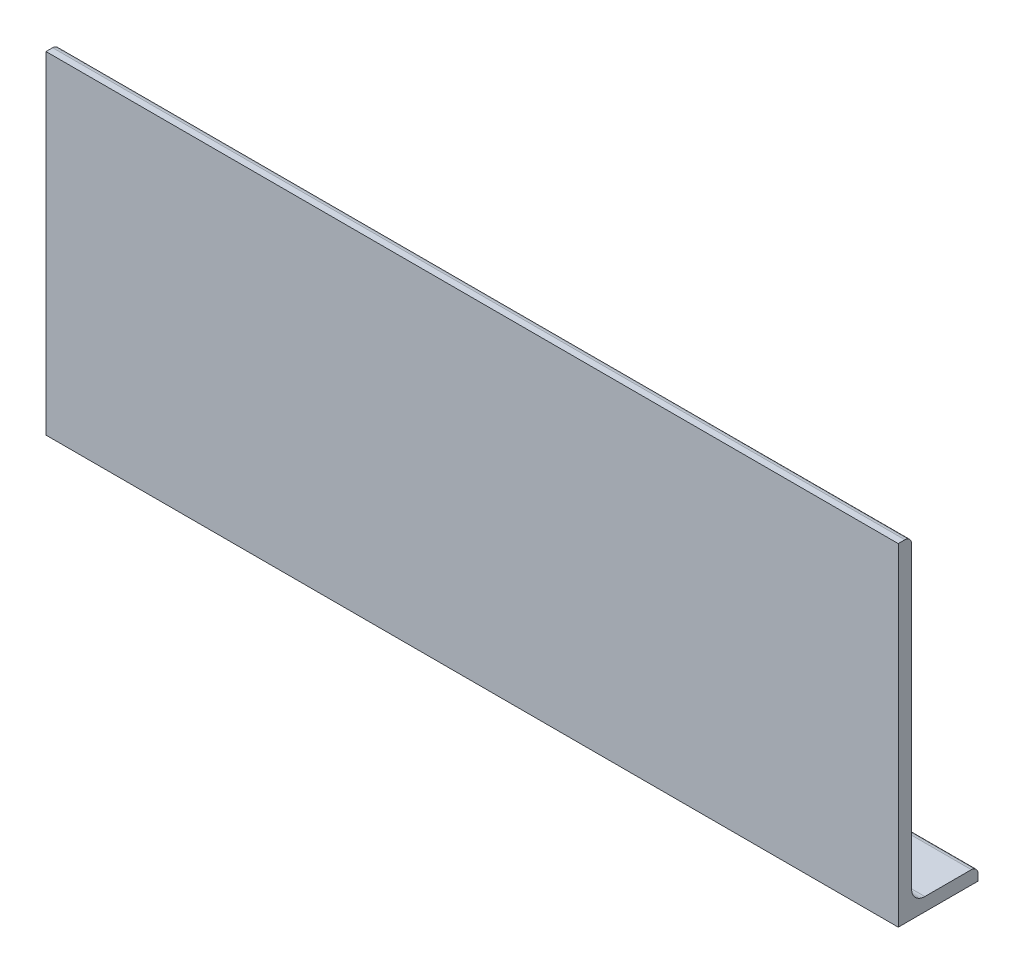
ISO-10303-21;
HEADER;
FILE_DESCRIPTION(('STEP AP214'),'2;1');
FILE_NAME('part.step','',(''),(''),'','','');
FILE_SCHEMA(('AUTOMOTIVE_DESIGN { 1 0 10303 214 1 1 1 1 }'));
ENDSEC;
DATA;
#1=APPLICATION_CONTEXT('core data for automotive mechanical design processes');
#2=APPLICATION_PROTOCOL_DEFINITION('international standard','automotive_design',2000,#1);
#3=PRODUCT_CONTEXT('',#1,'mechanical');
#4=PRODUCT('Part','Part','',(#3));
#5=PRODUCT_RELATED_PRODUCT_CATEGORY('part','',(#4));
#6=PRODUCT_DEFINITION_FORMATION('','',#4);
#7=PRODUCT_DEFINITION_CONTEXT('part definition',#1,'design');
#8=PRODUCT_DEFINITION('design','',#6,#7);
#9=PRODUCT_DEFINITION_SHAPE('','',#8);
#10=(LENGTH_UNIT() NAMED_UNIT(*) SI_UNIT(.MILLI.,.METRE.));
#11=(NAMED_UNIT(*) PLANE_ANGLE_UNIT() SI_UNIT($,.RADIAN.));
#12=(NAMED_UNIT(*) SI_UNIT($,.STERADIAN.) SOLID_ANGLE_UNIT());
#13=UNCERTAINTY_MEASURE_WITH_UNIT(LENGTH_MEASURE(1.E-05),#10,'distance_accuracy_value','');
#14=(GEOMETRIC_REPRESENTATION_CONTEXT(3) GLOBAL_UNCERTAINTY_ASSIGNED_CONTEXT((#13)) GLOBAL_UNIT_ASSIGNED_CONTEXT((#10,
#11,#12)) REPRESENTATION_CONTEXT('',''));
#15=CARTESIAN_POINT('',(0.,0.,0.));
#16=DIRECTION('',(0.,0.,1.));
#17=DIRECTION('',(1.,0.,0.));
#18=AXIS2_PLACEMENT_3D('',#15,#16,#17);
#19=CARTESIAN_POINT('',(128.27,-39.2153009702238,125.69753119505));
#20=DIRECTION('',(0.,-1.,0.));
#21=DIRECTION('',(0.,0.,-1.));
#22=AXIS2_PLACEMENT_3D('',#19,#20,#21);
#23=PLANE('',#22);
#24=DIRECTION('',(0.,0.,1.));
#25=VECTOR('',#24,1.);
#26=CARTESIAN_POINT('',(128.27,-39.2153009702238,125.69753119505));
#27=LINE('',#26,#25);
#28=CARTESIAN_POINT('',(128.27,-39.2153009702238,126.69753119505));
#29=VERTEX_POINT('',#28);
#30=CARTESIAN_POINT('',(128.27,-39.2153009702238,127.69753119505));
#31=VERTEX_POINT('',#30);
#32=EDGE_CURVE('E103',#29,#31,#27,.T.);
#33=ORIENTED_EDGE('',*,*,#32,.F.);
#34=DIRECTION('',(-1.,0.,0.));
#35=VECTOR('',#34,1.);
#36=CARTESIAN_POINT('',(128.27,-39.2153009702238,126.69753119505));
#37=LINE('',#36,#35);
#38=CARTESIAN_POINT('',(0.,-39.2153009702238,126.69753119505));
#39=VERTEX_POINT('',#38);
#40=EDGE_CURVE('E147',#29,#39,#37,.T.);
#41=ORIENTED_EDGE('',*,*,#40,.T.);
#42=DIRECTION('',(0.,0.,1.));
#43=VECTOR('',#42,1.);
#44=CARTESIAN_POINT('',(0.,-39.2153009702238,125.69753119505));
#45=LINE('',#44,#43);
#46=CARTESIAN_POINT('',(0.,-39.2153009702238,127.69753119505));
#47=VERTEX_POINT('',#46);
#48=EDGE_CURVE('E127',#39,#47,#45,.T.);
#49=ORIENTED_EDGE('',*,*,#48,.T.);
#50=DIRECTION('',(-1.,0.,0.));
#51=VECTOR('',#50,1.);
#52=CARTESIAN_POINT('',(128.27,-39.2153009702238,127.69753119505));
#53=LINE('',#52,#51);
#54=EDGE_CURVE('E120',#31,#47,#53,.T.);
#55=ORIENTED_EDGE('',*,*,#54,.F.);
#56=EDGE_LOOP('',(#33,#41,#49,#55));
#57=FACE_BOUND('',#56,.T.);
#58=ADVANCED_FACE('F33',(#57),#23,.F.);
#59=CARTESIAN_POINT('',(128.27,-39.2153009702238,127.69753119505));
#60=DIRECTION('',(0.,0.,-1.));
#61=DIRECTION('',(-1.,0.,0.));
#62=AXIS2_PLACEMENT_3D('',#59,#60,#61);
#63=PLANE('',#62);
#64=DIRECTION('',(0.,-1.,0.));
#65=VECTOR('',#64,1.);
#66=CARTESIAN_POINT('',(0.,-39.2153009702238,127.69753119505));
#67=LINE('',#66,#65);
#68=CARTESIAN_POINT('',(0.,-89.2153009702238,127.69753119505));
#69=VERTEX_POINT('',#68);
#70=EDGE_CURVE('E182',#47,#69,#67,.T.);
#71=ORIENTED_EDGE('',*,*,#70,.T.);
#72=DIRECTION('',(-1.,0.,0.));
#73=VECTOR('',#72,1.);
#74=CARTESIAN_POINT('',(128.27,-89.2153009702238,127.69753119505));
#75=LINE('',#74,#73);
#76=CARTESIAN_POINT('',(128.27,-89.2153009702238,127.69753119505));
#77=VERTEX_POINT('',#76);
#78=EDGE_CURVE('E122',#77,#69,#75,.T.);
#79=ORIENTED_EDGE('',*,*,#78,.F.);
#80=DIRECTION('',(0.,-1.,0.));
#81=VECTOR('',#80,1.);
#82=CARTESIAN_POINT('',(128.27,-39.2153009702238,127.69753119505));
#83=LINE('',#82,#81);
#84=EDGE_CURVE('E107',#31,#77,#83,.T.);
#85=ORIENTED_EDGE('',*,*,#84,.F.);
#86=ORIENTED_EDGE('',*,*,#54,.T.);
#87=EDGE_LOOP('',(#71,#79,#85,#86));
#88=FACE_BOUND('',#87,.T.);
#89=ADVANCED_FACE('F119',(#88),#63,.F.);
#90=CARTESIAN_POINT('',(128.27,-89.2153009702238,127.69753119505));
#91=DIRECTION('',(0.,1.,0.));
#92=DIRECTION('',(0.,0.,1.));
#93=AXIS2_PLACEMENT_3D('',#90,#91,#92);
#94=PLANE('',#93);
#95=CARTESIAN_POINT('',(20.,-89.2153009702238,120.19753119505));
#96=DIRECTION('',(0.,1.,0.));
#97=DIRECTION('',(0.,0.,1.));
#98=AXIS2_PLACEMENT_3D('',#95,#96,#97);
#99=CIRCLE('',#98,1.60000000000001);
#100=CARTESIAN_POINT('',(20.,-89.2153009702238,121.79753119505));
#101=VERTEX_POINT('',#100);
#102=EDGE_CURVE('E183',#101,#101,#99,.T.);
#103=ORIENTED_EDGE('',*,*,#102,.T.);
#104=EDGE_LOOP('',(#103));
#105=FACE_BOUND('',#104,.T.);
#106=CARTESIAN_POINT('',(108.27,-89.2153009702238,120.19753119505));
#107=DIRECTION('',(0.,1.,0.));
#108=DIRECTION('',(0.,0.,1.));
#109=AXIS2_PLACEMENT_3D('',#106,#107,#108);
#110=CIRCLE('',#109,1.60000000000001);
#111=CARTESIAN_POINT('',(108.27,-89.2153009702238,121.79753119505));
#112=VERTEX_POINT('',#111);
#113=EDGE_CURVE('E240',#112,#112,#110,.T.);
#114=ORIENTED_EDGE('',*,*,#113,.T.);
#115=EDGE_LOOP('',(#114));
#116=FACE_BOUND('',#115,.T.);
#117=DIRECTION('',(0.,0.,-1.));
#118=VECTOR('',#117,1.);
#119=CARTESIAN_POINT('',(0.,-89.2153009702238,127.69753119505));
#120=LINE('',#119,#118);
#121=CARTESIAN_POINT('',(0.,-89.2153009702238,115.69753119505));
#122=VERTEX_POINT('',#121);
#123=EDGE_CURVE('E185',#69,#122,#120,.T.);
#124=ORIENTED_EDGE('',*,*,#123,.T.);
#125=DIRECTION('',(-1.,0.,0.));
#126=VECTOR('',#125,1.);
#127=CARTESIAN_POINT('',(128.27,-89.2153009702238,115.69753119505));
#128=LINE('',#127,#126);
#129=CARTESIAN_POINT('',(128.27,-89.2153009702238,115.69753119505));
#130=VERTEX_POINT('',#129);
#131=EDGE_CURVE('E134',#130,#122,#128,.T.);
#132=ORIENTED_EDGE('',*,*,#131,.F.);
#133=DIRECTION('',(0.,0.,-1.));
#134=VECTOR('',#133,1.);
#135=CARTESIAN_POINT('',(128.27,-89.2153009702238,127.69753119505));
#136=LINE('',#135,#134);
#137=EDGE_CURVE('E124',#77,#130,#136,.T.);
#138=ORIENTED_EDGE('',*,*,#137,.F.);
#139=ORIENTED_EDGE('',*,*,#78,.T.);
#140=EDGE_LOOP('',(#124,#132,#138,#139));
#141=FACE_BOUND('',#140,.T.);
#142=ADVANCED_FACE('F210',(#105,#116,#141),#94,.F.);
#143=CARTESIAN_POINT('',(128.27,-89.2153009702238,115.69753119505));
#144=DIRECTION('',(0.,0.,1.));
#145=DIRECTION('',(1.,0.,0.));
#146=AXIS2_PLACEMENT_3D('',#143,#144,#145);
#147=PLANE('',#146);
#148=DIRECTION('',(0.,1.,0.));
#149=VECTOR('',#148,1.);
#150=CARTESIAN_POINT('',(0.,-89.2153009702238,115.69753119505));
#151=LINE('',#150,#149);
#152=CARTESIAN_POINT('',(0.,-88.2153009702239,115.69753119505));
#153=VERTEX_POINT('',#152);
#154=EDGE_CURVE('E166',#122,#153,#151,.T.);
#155=ORIENTED_EDGE('',*,*,#154,.T.);
#156=DIRECTION('',(-1.,0.,0.));
#157=VECTOR('',#156,1.);
#158=CARTESIAN_POINT('',(128.27,-88.2153009702239,115.69753119505));
#159=LINE('',#158,#157);
#160=CARTESIAN_POINT('',(128.27,-88.2153009702239,115.69753119505));
#161=VERTEX_POINT('',#160);
#162=EDGE_CURVE('E142',#153,#161,#159,.F.);
#163=ORIENTED_EDGE('',*,*,#162,.T.);
#164=DIRECTION('',(0.,1.,0.));
#165=VECTOR('',#164,1.);
#166=CARTESIAN_POINT('',(128.27,-89.2153009702238,115.69753119505));
#167=LINE('',#166,#165);
#168=EDGE_CURVE('E177',#130,#161,#167,.T.);
#169=ORIENTED_EDGE('',*,*,#168,.F.);
#170=ORIENTED_EDGE('',*,*,#131,.T.);
#171=EDGE_LOOP('',(#155,#163,#169,#170));
#172=FACE_BOUND('',#171,.T.);
#173=ADVANCED_FACE('F187',(#172),#147,.F.);
#174=CARTESIAN_POINT('',(128.27,-87.2153009702239,115.69753119505));
#175=DIRECTION('',(0.,-1.,0.));
#176=DIRECTION('',(0.,0.,-1.));
#177=AXIS2_PLACEMENT_3D('',#174,#175,#176);
#178=PLANE('',#177);
#179=CARTESIAN_POINT('',(20.,-87.2153009702239,120.19753119505));
#180=DIRECTION('',(0.,1.,0.));
#181=DIRECTION('',(0.,0.,1.));
#182=AXIS2_PLACEMENT_3D('',#179,#180,#181);
#183=CIRCLE('',#182,1.60000000000001);
#184=CARTESIAN_POINT('',(20.,-87.2153009702239,121.79753119505));
#185=VERTEX_POINT('',#184);
#186=EDGE_CURVE('E247',#185,#185,#183,.T.);
#187=ORIENTED_EDGE('',*,*,#186,.F.);
#188=EDGE_LOOP('',(#187));
#189=FACE_BOUND('',#188,.T.);
#190=CARTESIAN_POINT('',(108.27,-87.2153009702239,120.19753119505));
#191=DIRECTION('',(0.,1.,0.));
#192=DIRECTION('',(0.,0.,1.));
#193=AXIS2_PLACEMENT_3D('',#190,#191,#192);
#194=CIRCLE('',#193,1.60000000000001);
#195=CARTESIAN_POINT('',(108.27,-87.2153009702239,121.79753119505));
#196=VERTEX_POINT('',#195);
#197=EDGE_CURVE('E243',#196,#196,#194,.T.);
#198=ORIENTED_EDGE('',*,*,#197,.F.);
#199=EDGE_LOOP('',(#198));
#200=FACE_BOUND('',#199,.T.);
#201=DIRECTION('',(0.,0.,1.));
#202=VECTOR('',#201,1.);
#203=CARTESIAN_POINT('',(0.,-87.2153009702239,115.69753119505));
#204=LINE('',#203,#202);
#205=CARTESIAN_POINT('',(0.,-87.2153009702239,116.69753119505));
#206=VERTEX_POINT('',#205);
#207=CARTESIAN_POINT('',(0.,-87.2153009702239,123.69753119505));
#208=VERTEX_POINT('',#207);
#209=EDGE_CURVE('E164',#206,#208,#204,.T.);
#210=ORIENTED_EDGE('',*,*,#209,.T.);
#211=DIRECTION('',(-1.,0.,0.));
#212=VECTOR('',#211,1.);
#213=CARTESIAN_POINT('',(128.27,-87.2153009702239,123.69753119505));
#214=LINE('',#213,#212);
#215=CARTESIAN_POINT('',(128.27,-87.2153009702239,123.69753119505));
#216=VERTEX_POINT('',#215);
#217=EDGE_CURVE('E54',#208,#216,#214,.F.);
#218=ORIENTED_EDGE('',*,*,#217,.T.);
#219=DIRECTION('',(0.,0.,1.));
#220=VECTOR('',#219,1.);
#221=CARTESIAN_POINT('',(128.27,-87.2153009702239,115.69753119505));
#222=LINE('',#221,#220);
#223=CARTESIAN_POINT('',(128.27,-87.2153009702239,116.69753119505));
#224=VERTEX_POINT('',#223);
#225=EDGE_CURVE('E175',#224,#216,#222,.T.);
#226=ORIENTED_EDGE('',*,*,#225,.F.);
#227=DIRECTION('',(-1.,0.,0.));
#228=VECTOR('',#227,1.);
#229=CARTESIAN_POINT('',(128.27,-87.2153009702239,116.69753119505));
#230=LINE('',#229,#228);
#231=EDGE_CURVE('E129',#224,#206,#230,.T.);
#232=ORIENTED_EDGE('',*,*,#231,.T.);
#233=EDGE_LOOP('',(#210,#218,#226,#232));
#234=FACE_BOUND('',#233,.T.);
#235=ADVANCED_FACE('F193',(#189,#200,#234),#178,.F.);
#236=CARTESIAN_POINT('',(128.27,-87.2153009702239,125.69753119505));
#237=DIRECTION('',(0.,0.,1.));
#238=DIRECTION('',(1.,0.,0.));
#239=AXIS2_PLACEMENT_3D('',#236,#237,#238);
#240=PLANE('',#239);
#241=DIRECTION('',(0.,1.,0.));
#242=VECTOR('',#241,1.);
#243=CARTESIAN_POINT('',(128.27,-87.2153009702239,125.69753119505));
#244=LINE('',#243,#242);
#245=CARTESIAN_POINT('',(128.27,-85.2153009702239,125.69753119505));
#246=VERTEX_POINT('',#245);
#247=CARTESIAN_POINT('',(128.27,-40.2153009702238,125.69753119505));
#248=VERTEX_POINT('',#247);
#249=EDGE_CURVE('E159',#246,#248,#244,.T.);
#250=ORIENTED_EDGE('',*,*,#249,.F.);
#251=DIRECTION('',(-1.,0.,0.));
#252=VECTOR('',#251,1.);
#253=CARTESIAN_POINT('',(0.,-85.2153009702239,125.69753119505));
#254=LINE('',#253,#252);
#255=CARTESIAN_POINT('',(0.,-85.2153009702239,125.69753119505));
#256=VERTEX_POINT('',#255);
#257=EDGE_CURVE('E152',#246,#256,#254,.T.);
#258=ORIENTED_EDGE('',*,*,#257,.T.);
#259=DIRECTION('',(0.,1.,0.));
#260=VECTOR('',#259,1.);
#261=CARTESIAN_POINT('',(0.,-87.2153009702239,125.69753119505));
#262=LINE('',#261,#260);
#263=CARTESIAN_POINT('',(0.,-40.2153009702238,125.69753119505));
#264=VERTEX_POINT('',#263);
#265=EDGE_CURVE('E115',#256,#264,#262,.T.);
#266=ORIENTED_EDGE('',*,*,#265,.T.);
#267=DIRECTION('',(-1.,0.,0.));
#268=VECTOR('',#267,1.);
#269=CARTESIAN_POINT('',(128.27,-40.2153009702238,125.69753119505));
#270=LINE('',#269,#268);
#271=EDGE_CURVE('E149',#264,#248,#270,.F.);
#272=ORIENTED_EDGE('',*,*,#271,.T.);
#273=EDGE_LOOP('',(#250,#258,#266,#272));
#274=FACE_BOUND('',#273,.T.);
#275=ADVANCED_FACE('F158',(#274),#240,.F.);
#276=CARTESIAN_POINT('',(128.27,0.,0.));
#277=DIRECTION('',(1.,0.,0.));
#278=DIRECTION('',(0.,0.,-1.));
#279=AXIS2_PLACEMENT_3D('',#276,#277,#278);
#280=PLANE('',#279);
#281=ORIENTED_EDGE('',*,*,#168,.T.);
#282=CARTESIAN_POINT('',(128.27,-88.2153009702239,116.69753119505));
#283=DIRECTION('',(1.,0.,0.));
#284=DIRECTION('',(0.,0.,-1.));
#285=AXIS2_PLACEMENT_3D('',#282,#283,#284);
#286=CIRCLE('',#285,1.);
#287=EDGE_CURVE('E145',#161,#224,#286,.T.);
#288=ORIENTED_EDGE('',*,*,#287,.T.);
#289=ORIENTED_EDGE('',*,*,#225,.T.);
#290=CARTESIAN_POINT('',(128.27,-85.2153009702239,123.69753119505));
#291=DIRECTION('',(1.,0.,0.));
#292=DIRECTION('',(0.,0.,-1.));
#293=AXIS2_PLACEMENT_3D('',#290,#291,#292);
#294=CIRCLE('',#293,2.);
#295=EDGE_CURVE('E11',#216,#246,#294,.F.);
#296=ORIENTED_EDGE('',*,*,#295,.T.);
#297=ORIENTED_EDGE('',*,*,#249,.T.);
#298=CARTESIAN_POINT('',(128.27,-40.2153009702238,126.69753119505));
#299=DIRECTION('',(1.,0.,0.));
#300=DIRECTION('',(0.,0.,-1.));
#301=AXIS2_PLACEMENT_3D('',#298,#299,#300);
#302=CIRCLE('',#301,1.);
#303=EDGE_CURVE('E110',#248,#29,#302,.T.);
#304=ORIENTED_EDGE('',*,*,#303,.T.);
#305=ORIENTED_EDGE('',*,*,#32,.T.);
#306=ORIENTED_EDGE('',*,*,#84,.T.);
#307=ORIENTED_EDGE('',*,*,#137,.T.);
#308=EDGE_LOOP('',(#281,#288,#289,#296,#297,#304,#305,#306,#307));
#309=FACE_BOUND('',#308,.T.);
#310=ADVANCED_FACE('F106',(#309),#280,.T.);
#311=CARTESIAN_POINT('',(0.,0.,0.));
#312=DIRECTION('',(1.,0.,0.));
#313=DIRECTION('',(0.,0.,-1.));
#314=AXIS2_PLACEMENT_3D('',#311,#312,#313);
#315=PLANE('',#314);
#316=ORIENTED_EDGE('',*,*,#209,.F.);
#317=CARTESIAN_POINT('',(0.,-88.2153009702239,116.69753119505));
#318=DIRECTION('',(1.,0.,0.));
#319=DIRECTION('',(0.,0.,-1.));
#320=AXIS2_PLACEMENT_3D('',#317,#318,#319);
#321=CIRCLE('',#320,1.);
#322=EDGE_CURVE('E140',#206,#153,#321,.F.);
#323=ORIENTED_EDGE('',*,*,#322,.T.);
#324=ORIENTED_EDGE('',*,*,#154,.F.);
#325=ORIENTED_EDGE('',*,*,#123,.F.);
#326=ORIENTED_EDGE('',*,*,#70,.F.);
#327=ORIENTED_EDGE('',*,*,#48,.F.);
#328=CARTESIAN_POINT('',(0.,-40.2153009702238,126.69753119505));
#329=DIRECTION('',(1.,0.,0.));
#330=DIRECTION('',(0.,0.,-1.));
#331=AXIS2_PLACEMENT_3D('',#328,#329,#330);
#332=CIRCLE('',#331,1.);
#333=EDGE_CURVE('E132',#39,#264,#332,.F.);
#334=ORIENTED_EDGE('',*,*,#333,.T.);
#335=ORIENTED_EDGE('',*,*,#265,.F.);
#336=CARTESIAN_POINT('',(0.,-85.2153009702239,123.69753119505));
#337=DIRECTION('',(1.,0.,0.));
#338=DIRECTION('',(0.,0.,-1.));
#339=AXIS2_PLACEMENT_3D('',#336,#337,#338);
#340=CIRCLE('',#339,2.);
#341=EDGE_CURVE('E41',#256,#208,#340,.T.);
#342=ORIENTED_EDGE('',*,*,#341,.T.);
#343=EDGE_LOOP('',(#316,#323,#324,#325,#326,#327,#334,#335,#342));
#344=FACE_BOUND('',#343,.T.);
#345=ADVANCED_FACE('F162',(#344),#315,.F.);
#346=CARTESIAN_POINT('',(128.27,-88.2153009702239,116.69753119505));
#347=DIRECTION('',(-1.,0.,0.));
#348=DIRECTION('',(0.,0.,1.));
#349=AXIS2_PLACEMENT_3D('',#346,#347,#348);
#350=CYLINDRICAL_SURFACE('',#349,1.);
#351=ORIENTED_EDGE('',*,*,#287,.F.);
#352=ORIENTED_EDGE('',*,*,#162,.F.);
#353=ORIENTED_EDGE('',*,*,#322,.F.);
#354=ORIENTED_EDGE('',*,*,#231,.F.);
#355=EDGE_LOOP('',(#351,#352,#353,#354));
#356=FACE_BOUND('',#355,.T.);
#357=ADVANCED_FACE('F191',(#356),#350,.T.);
#358=CARTESIAN_POINT('',(128.27,-40.2153009702238,126.69753119505));
#359=DIRECTION('',(-1.,0.,0.));
#360=DIRECTION('',(0.,0.,1.));
#361=AXIS2_PLACEMENT_3D('',#358,#359,#360);
#362=CYLINDRICAL_SURFACE('',#361,1.);
#363=ORIENTED_EDGE('',*,*,#303,.F.);
#364=ORIENTED_EDGE('',*,*,#271,.F.);
#365=ORIENTED_EDGE('',*,*,#333,.F.);
#366=ORIENTED_EDGE('',*,*,#40,.F.);
#367=EDGE_LOOP('',(#363,#364,#365,#366));
#368=FACE_BOUND('',#367,.T.);
#369=ADVANCED_FACE('F196',(#368),#362,.T.);
#370=CARTESIAN_POINT('',(128.27,-85.2153009702239,123.69753119505));
#371=DIRECTION('',(1.,0.,0.));
#372=DIRECTION('',(0.,0.,-1.));
#373=AXIS2_PLACEMENT_3D('',#370,#371,#372);
#374=CYLINDRICAL_SURFACE('',#373,2.);
#375=ORIENTED_EDGE('',*,*,#295,.F.);
#376=ORIENTED_EDGE('',*,*,#217,.F.);
#377=ORIENTED_EDGE('',*,*,#341,.F.);
#378=ORIENTED_EDGE('',*,*,#257,.F.);
#379=EDGE_LOOP('',(#375,#376,#377,#378));
#380=FACE_BOUND('',#379,.T.);
#381=ADVANCED_FACE('F35',(#380),#374,.F.);
#382=CARTESIAN_POINT('',(108.27,-89.2153009702238,120.19753119505));
#383=DIRECTION('',(0.,1.,0.));
#384=DIRECTION('',(0.,0.,1.));
#385=AXIS2_PLACEMENT_3D('',#382,#383,#384);
#386=CYLINDRICAL_SURFACE('',#385,1.60000000000001);
#387=ORIENTED_EDGE('',*,*,#113,.F.);
#388=EDGE_LOOP('',(#387));
#389=FACE_BOUND('',#388,.T.);
#390=ORIENTED_EDGE('',*,*,#197,.T.);
#391=EDGE_LOOP('',(#390));
#392=FACE_BOUND('',#391,.T.);
#393=ADVANCED_FACE('F195',(#389,#392),#386,.F.);
#394=CARTESIAN_POINT('',(20.,-89.2153009702238,120.19753119505));
#395=DIRECTION('',(0.,1.,0.));
#396=DIRECTION('',(0.,0.,1.));
#397=AXIS2_PLACEMENT_3D('',#394,#395,#396);
#398=CYLINDRICAL_SURFACE('',#397,1.60000000000001);
#399=ORIENTED_EDGE('',*,*,#102,.F.);
#400=EDGE_LOOP('',(#399));
#401=FACE_BOUND('',#400,.T.);
#402=ORIENTED_EDGE('',*,*,#186,.T.);
#403=EDGE_LOOP('',(#402));
#404=FACE_BOUND('',#403,.T.);
#405=ADVANCED_FACE('F201',(#401,#404),#398,.F.);
#406=CLOSED_SHELL('',(#58,#89,#142,#173,#235,#275,#310,#345,#357,#369,#381,#393,#405));
#407=MANIFOLD_SOLID_BREP('B2',#406);
#408=ADVANCED_BREP_SHAPE_REPRESENTATION('',(#18,#407),#14);
#409=SHAPE_DEFINITION_REPRESENTATION(#9,#408);
ENDSEC;
END-ISO-10303-21;
